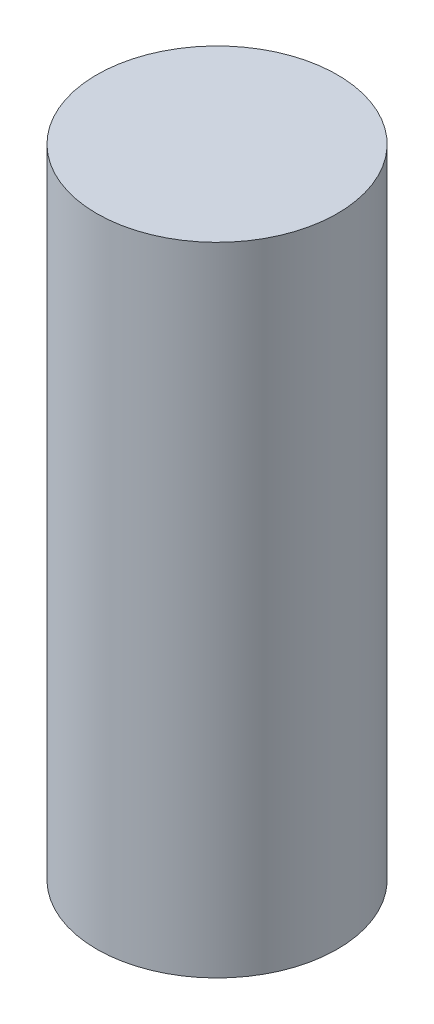
ISO-10303-21;
HEADER;
FILE_DESCRIPTION(('STEP AP214'),'2;1');
FILE_NAME('part.step','',(''),(''),'','','');
FILE_SCHEMA(('AUTOMOTIVE_DESIGN { 1 0 10303 214 1 1 1 1 }'));
ENDSEC;
DATA;
#1=APPLICATION_CONTEXT('core data for automotive mechanical design processes');
#2=APPLICATION_PROTOCOL_DEFINITION('international standard','automotive_design',2000,#1);
#3=PRODUCT_CONTEXT('',#1,'mechanical');
#4=PRODUCT('Part','Part','',(#3));
#5=PRODUCT_RELATED_PRODUCT_CATEGORY('part','',(#4));
#6=PRODUCT_DEFINITION_FORMATION('','',#4);
#7=PRODUCT_DEFINITION_CONTEXT('part definition',#1,'design');
#8=PRODUCT_DEFINITION('design','',#6,#7);
#9=PRODUCT_DEFINITION_SHAPE('','',#8);
#10=(LENGTH_UNIT() NAMED_UNIT(*) SI_UNIT(.MILLI.,.METRE.));
#11=(NAMED_UNIT(*) PLANE_ANGLE_UNIT() SI_UNIT($,.RADIAN.));
#12=(NAMED_UNIT(*) SI_UNIT($,.STERADIAN.) SOLID_ANGLE_UNIT());
#13=UNCERTAINTY_MEASURE_WITH_UNIT(LENGTH_MEASURE(1.E-05),#10,'distance_accuracy_value','');
#14=(GEOMETRIC_REPRESENTATION_CONTEXT(3) GLOBAL_UNCERTAINTY_ASSIGNED_CONTEXT((#13)) GLOBAL_UNIT_ASSIGNED_CONTEXT((#10,
#11,#12)) REPRESENTATION_CONTEXT('',''));
#15=CARTESIAN_POINT('',(0.,0.,0.));
#16=DIRECTION('',(0.,0.,1.));
#17=DIRECTION('',(1.,0.,0.));
#18=AXIS2_PLACEMENT_3D('',#15,#16,#17);
#19=CARTESIAN_POINT('',(0.,15.89,0.));
#20=DIRECTION('',(0.,-1.,0.));
#21=DIRECTION('',(0.,0.,-1.));
#22=AXIS2_PLACEMENT_3D('',#19,#20,#21);
#23=CYLINDRICAL_SURFACE('',#22,3.);
#24=CARTESIAN_POINT('',(0.,15.89,0.));
#25=DIRECTION('',(0.,1.,0.));
#26=DIRECTION('',(0.,0.,1.));
#27=AXIS2_PLACEMENT_3D('',#24,#25,#26);
#28=CIRCLE('',#27,3.);
#29=CARTESIAN_POINT('',(0.,15.89,3.));
#30=VERTEX_POINT('',#29);
#31=EDGE_CURVE('E10',#30,#30,#28,.T.);
#32=ORIENTED_EDGE('',*,*,#31,.F.);
#33=EDGE_LOOP('',(#32));
#34=FACE_BOUND('',#33,.T.);
#35=CARTESIAN_POINT('',(0.,0.,0.));
#36=DIRECTION('',(0.,1.,0.));
#37=DIRECTION('',(0.,0.,1.));
#38=AXIS2_PLACEMENT_3D('',#35,#36,#37);
#39=CIRCLE('',#38,3.);
#40=CARTESIAN_POINT('',(0.,0.,3.));
#41=VERTEX_POINT('',#40);
#42=EDGE_CURVE('E34',#41,#41,#39,.T.);
#43=ORIENTED_EDGE('',*,*,#42,.T.);
#44=EDGE_LOOP('',(#43));
#45=FACE_BOUND('',#44,.T.);
#46=ADVANCED_FACE('F31',(#34,#45),#23,.T.);
#47=CARTESIAN_POINT('',(0.,15.89,0.));
#48=DIRECTION('',(0.,1.,0.));
#49=DIRECTION('',(0.,0.,1.));
#50=AXIS2_PLACEMENT_3D('',#47,#48,#49);
#51=PLANE('',#50);
#52=ORIENTED_EDGE('',*,*,#31,.T.);
#53=EDGE_LOOP('',(#52));
#54=FACE_BOUND('',#53,.T.);
#55=ADVANCED_FACE('F46',(#54),#51,.T.);
#56=CARTESIAN_POINT('',(0.,0.,0.));
#57=DIRECTION('',(0.,1.,0.));
#58=DIRECTION('',(0.,0.,1.));
#59=AXIS2_PLACEMENT_3D('',#56,#57,#58);
#60=PLANE('',#59);
#61=ORIENTED_EDGE('',*,*,#42,.F.);
#62=EDGE_LOOP('',(#61));
#63=FACE_BOUND('',#62,.T.);
#64=ADVANCED_FACE('F44',(#63),#60,.F.);
#65=CLOSED_SHELL('',(#46,#55,#64));
#66=MANIFOLD_SOLID_BREP('B2',#65);
#67=ADVANCED_BREP_SHAPE_REPRESENTATION('',(#18,#66),#14);
#68=SHAPE_DEFINITION_REPRESENTATION(#9,#67);
ENDSEC;
END-ISO-10303-21;
